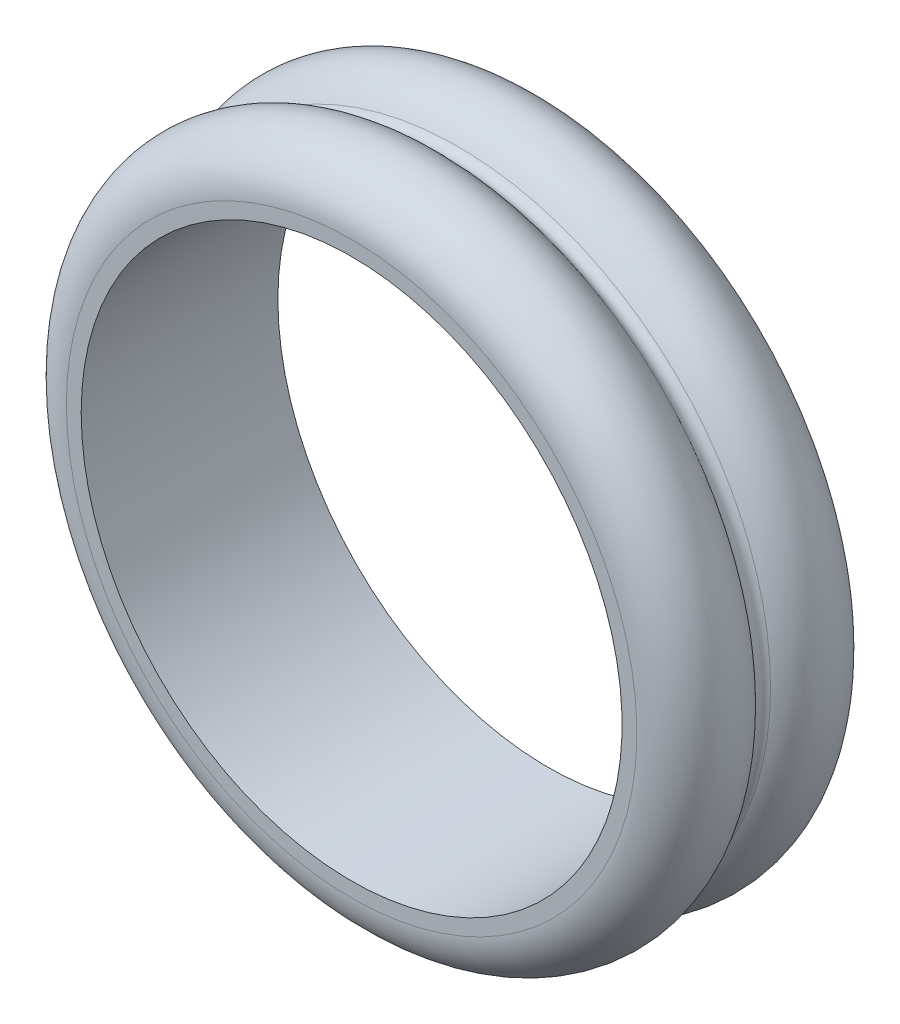
ISO-10303-21;
HEADER;
FILE_DESCRIPTION(('STEP AP214'),'2;1');
FILE_NAME('part.step','',(''),(''),'','','');
FILE_SCHEMA(('AUTOMOTIVE_DESIGN { 1 0 10303 214 1 1 1 1 }'));
ENDSEC;
DATA;
#1=APPLICATION_CONTEXT('core data for automotive mechanical design processes');
#2=APPLICATION_PROTOCOL_DEFINITION('international standard','automotive_design',2000,#1);
#3=PRODUCT_CONTEXT('',#1,'mechanical');
#4=PRODUCT('Part','Part','',(#3));
#5=PRODUCT_RELATED_PRODUCT_CATEGORY('part','',(#4));
#6=PRODUCT_DEFINITION_FORMATION('','',#4);
#7=PRODUCT_DEFINITION_CONTEXT('part definition',#1,'design');
#8=PRODUCT_DEFINITION('design','',#6,#7);
#9=PRODUCT_DEFINITION_SHAPE('','',#8);
#10=(LENGTH_UNIT() NAMED_UNIT(*) SI_UNIT(.MILLI.,.METRE.));
#11=(NAMED_UNIT(*) PLANE_ANGLE_UNIT() SI_UNIT($,.RADIAN.));
#12=(NAMED_UNIT(*) SI_UNIT($,.STERADIAN.) SOLID_ANGLE_UNIT());
#13=UNCERTAINTY_MEASURE_WITH_UNIT(LENGTH_MEASURE(1.E-05),#10,'distance_accuracy_value','');
#14=(GEOMETRIC_REPRESENTATION_CONTEXT(3) GLOBAL_UNCERTAINTY_ASSIGNED_CONTEXT((#13)) GLOBAL_UNIT_ASSIGNED_CONTEXT((#10,
#11,#12)) REPRESENTATION_CONTEXT('',''));
#15=CARTESIAN_POINT('',(0.,0.,0.));
#16=DIRECTION('',(0.,0.,1.));
#17=DIRECTION('',(1.,0.,0.));
#18=AXIS2_PLACEMENT_3D('',#15,#16,#17);
#19=CARTESIAN_POINT('',(25.,0.,-10.));
#20=DIRECTION('',(0.,0.,1.));
#21=DIRECTION('',(1.,0.,0.));
#22=AXIS2_PLACEMENT_3D('',#19,#20,#21);
#23=PLANE('',#22);
#24=CARTESIAN_POINT('',(0.,0.,-10.));
#25=DIRECTION('',(0.,0.,-1.));
#26=DIRECTION('',(-1.,0.,0.));
#27=AXIS2_PLACEMENT_3D('',#24,#25,#26);
#28=CIRCLE('',#27,27.5);
#29=CARTESIAN_POINT('',(-27.5,0.,-10.));
#30=VERTEX_POINT('',#29);
#31=EDGE_CURVE('E53',#30,#30,#28,.T.);
#32=ORIENTED_EDGE('',*,*,#31,.F.);
#33=EDGE_LOOP('',(#32));
#34=FACE_BOUND('',#33,.T.);
#35=CARTESIAN_POINT('',(0.,0.,-10.));
#36=DIRECTION('',(0.,0.,-1.));
#37=DIRECTION('',(-1.,0.,0.));
#38=AXIS2_PLACEMENT_3D('',#35,#36,#37);
#39=CIRCLE('',#38,29.);
#40=CARTESIAN_POINT('',(-29.,0.,-10.));
#41=VERTEX_POINT('',#40);
#42=EDGE_CURVE('E50',#41,#41,#39,.T.);
#43=ORIENTED_EDGE('',*,*,#42,.T.);
#44=EDGE_LOOP('',(#43));
#45=FACE_BOUND('',#44,.T.);
#46=ADVANCED_FACE('F34',(#34,#45),#23,.F.);
#47=CARTESIAN_POINT('',(25.,0.,10.));
#48=DIRECTION('',(0.,0.,-1.));
#49=DIRECTION('',(-1.,0.,0.));
#50=AXIS2_PLACEMENT_3D('',#47,#48,#49);
#51=PLANE('',#50);
#52=CARTESIAN_POINT('',(0.,0.,10.));
#53=DIRECTION('',(0.,0.,-1.));
#54=DIRECTION('',(-1.,0.,0.));
#55=AXIS2_PLACEMENT_3D('',#52,#53,#54);
#56=CIRCLE('',#55,27.5);
#57=CARTESIAN_POINT('',(-27.5,0.,10.));
#58=VERTEX_POINT('',#57);
#59=EDGE_CURVE('E37',#58,#58,#56,.T.);
#60=ORIENTED_EDGE('',*,*,#59,.T.);
#61=EDGE_LOOP('',(#60));
#62=FACE_BOUND('',#61,.T.);
#63=CARTESIAN_POINT('',(0.,0.,10.));
#64=DIRECTION('',(0.,0.,-1.));
#65=DIRECTION('',(-1.,0.,0.));
#66=AXIS2_PLACEMENT_3D('',#63,#64,#65);
#67=CIRCLE('',#66,29.);
#68=CARTESIAN_POINT('',(-29.,0.,10.));
#69=VERTEX_POINT('',#68);
#70=EDGE_CURVE('E10',#69,#69,#67,.T.);
#71=ORIENTED_EDGE('',*,*,#70,.F.);
#72=EDGE_LOOP('',(#71));
#73=FACE_BOUND('',#72,.T.);
#74=ADVANCED_FACE('F60',(#62,#73),#51,.F.);
#75=CARTESIAN_POINT('',(0.,0.,5.));
#76=DIRECTION('',(0.,0.,-1.));
#77=DIRECTION('',(-1.,0.,0.));
#78=AXIS2_PLACEMENT_3D('',#75,#76,#77);
#79=TOROIDAL_SURFACE('',#78,29.,5.);
#80=CARTESIAN_POINT('',(0.,0.,0.833333333333325));
#81=DIRECTION('',(0.,0.,-1.));
#82=DIRECTION('',(-1.,0.,0.));
#83=AXIS2_PLACEMENT_3D('',#80,#81,#82);
#84=CIRCLE('',#83,31.7638539919629);
#85=CARTESIAN_POINT('',(-31.7638539919629,0.,0.833333333333325));
#86=VERTEX_POINT('',#85);
#87=EDGE_CURVE('E41',#86,#86,#84,.T.);
#88=ORIENTED_EDGE('',*,*,#87,.F.);
#89=EDGE_LOOP('',(#88));
#90=FACE_BOUND('',#89,.T.);
#91=ORIENTED_EDGE('',*,*,#70,.T.);
#92=EDGE_LOOP('',(#91));
#93=FACE_BOUND('',#92,.T.);
#94=ADVANCED_FACE('F78',(#90,#93),#79,.T.);
#95=CARTESIAN_POINT('',(0.,0.,0.));
#96=DIRECTION('',(0.,0.,-1.));
#97=DIRECTION('',(-1.,0.,0.));
#98=AXIS2_PLACEMENT_3D('',#95,#96,#97);
#99=TOROIDAL_SURFACE('',#98,32.3166247903554,1.);
#100=CARTESIAN_POINT('',(0.,0.,-0.833333333333325));
#101=DIRECTION('',(0.,0.,-1.));
#102=DIRECTION('',(-1.,0.,0.));
#103=AXIS2_PLACEMENT_3D('',#100,#101,#102);
#104=CIRCLE('',#103,31.7638539919629);
#105=CARTESIAN_POINT('',(-31.7638539919629,0.,-0.833333333333325));
#106=VERTEX_POINT('',#105);
#107=EDGE_CURVE('E45',#106,#106,#104,.T.);
#108=ORIENTED_EDGE('',*,*,#107,.F.);
#109=EDGE_LOOP('',(#108));
#110=FACE_BOUND('',#109,.T.);
#111=ORIENTED_EDGE('',*,*,#87,.T.);
#112=EDGE_LOOP('',(#111));
#113=FACE_BOUND('',#112,.T.);
#114=ADVANCED_FACE('F70',(#110,#113),#99,.F.);
#115=CARTESIAN_POINT('',(0.,0.,-5.));
#116=DIRECTION('',(0.,0.,-1.));
#117=DIRECTION('',(-1.,0.,0.));
#118=AXIS2_PLACEMENT_3D('',#115,#116,#117);
#119=TOROIDAL_SURFACE('',#118,29.,5.);
#120=ORIENTED_EDGE('',*,*,#42,.F.);
#121=EDGE_LOOP('',(#120));
#122=FACE_BOUND('',#121,.T.);
#123=ORIENTED_EDGE('',*,*,#107,.T.);
#124=EDGE_LOOP('',(#123));
#125=FACE_BOUND('',#124,.T.);
#126=ADVANCED_FACE('F65',(#122,#125),#119,.T.);
#127=CARTESIAN_POINT('',(0.,0.,45.));
#128=DIRECTION('',(0.,0.,-1.));
#129=DIRECTION('',(-1.,0.,0.));
#130=AXIS2_PLACEMENT_3D('',#127,#128,#129);
#131=CYLINDRICAL_SURFACE('',#130,27.5);
#132=ORIENTED_EDGE('',*,*,#31,.T.);
#133=EDGE_LOOP('',(#132));
#134=FACE_BOUND('',#133,.T.);
#135=ORIENTED_EDGE('',*,*,#59,.F.);
#136=EDGE_LOOP('',(#135));
#137=FACE_BOUND('',#136,.T.);
#138=ADVANCED_FACE('F63',(#134,#137),#131,.F.);
#139=CLOSED_SHELL('',(#46,#74,#94,#114,#126,#138));
#140=MANIFOLD_SOLID_BREP('B2',#139);
#141=ADVANCED_BREP_SHAPE_REPRESENTATION('',(#18,#140),#14);
#142=SHAPE_DEFINITION_REPRESENTATION(#9,#141);
ENDSEC;
END-ISO-10303-21;
